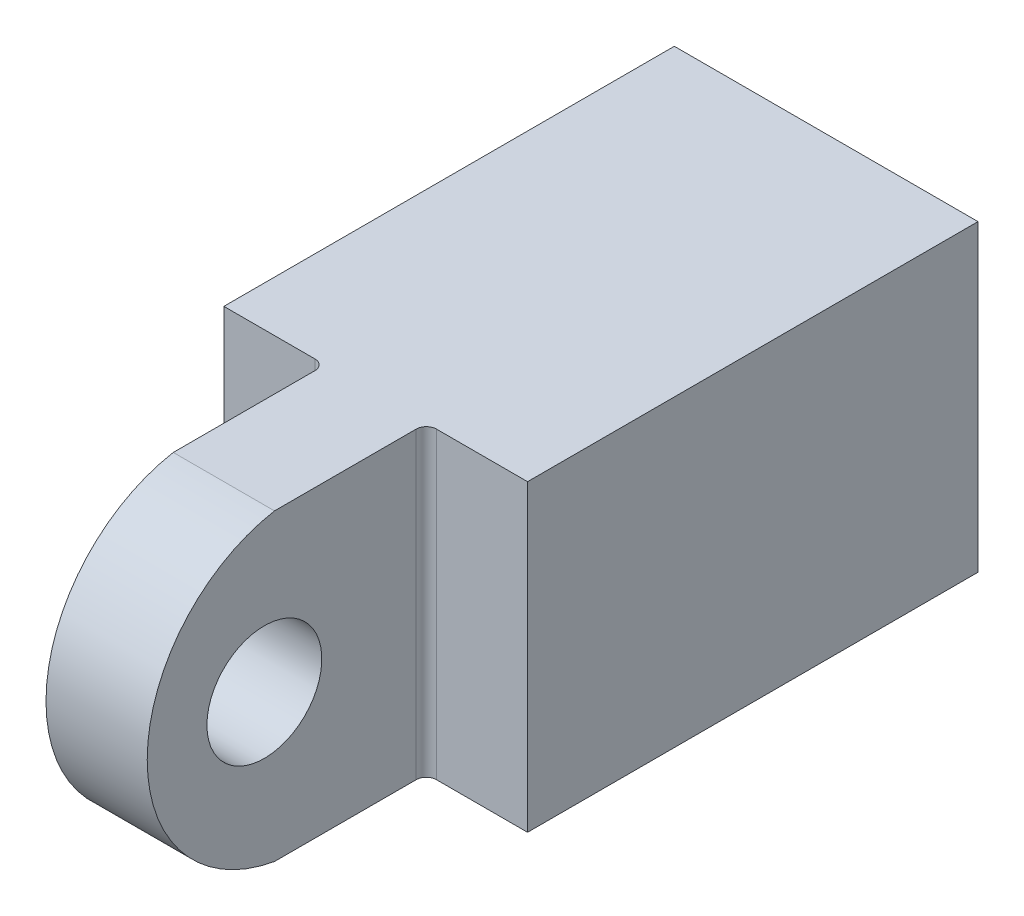
ISO-10303-21;
HEADER;
FILE_DESCRIPTION(('STEP AP214'),'2;1');
FILE_NAME('part.step','',(''),(''),'','','');
FILE_SCHEMA(('AUTOMOTIVE_DESIGN { 1 0 10303 214 1 1 1 1 }'));
ENDSEC;
DATA;
#1=APPLICATION_CONTEXT('core data for automotive mechanical design processes');
#2=APPLICATION_PROTOCOL_DEFINITION('international standard','automotive_design',2000,#1);
#3=PRODUCT_CONTEXT('',#1,'mechanical');
#4=PRODUCT('Part','Part','',(#3));
#5=PRODUCT_RELATED_PRODUCT_CATEGORY('part','',(#4));
#6=PRODUCT_DEFINITION_FORMATION('','',#4);
#7=PRODUCT_DEFINITION_CONTEXT('part definition',#1,'design');
#8=PRODUCT_DEFINITION('design','',#6,#7);
#9=PRODUCT_DEFINITION_SHAPE('','',#8);
#10=(LENGTH_UNIT() NAMED_UNIT(*) SI_UNIT(.MILLI.,.METRE.));
#11=(NAMED_UNIT(*) PLANE_ANGLE_UNIT() SI_UNIT($,.RADIAN.));
#12=(NAMED_UNIT(*) SI_UNIT($,.STERADIAN.) SOLID_ANGLE_UNIT());
#13=UNCERTAINTY_MEASURE_WITH_UNIT(LENGTH_MEASURE(1.E-05),#10,'distance_accuracy_value','');
#14=(GEOMETRIC_REPRESENTATION_CONTEXT(3) GLOBAL_UNCERTAINTY_ASSIGNED_CONTEXT((#13)) GLOBAL_UNIT_ASSIGNED_CONTEXT((#10,
#11,#12)) REPRESENTATION_CONTEXT('',''));
#15=CARTESIAN_POINT('',(0.,0.,0.));
#16=DIRECTION('',(0.,0.,1.));
#17=DIRECTION('',(1.,0.,0.));
#18=AXIS2_PLACEMENT_3D('',#15,#16,#17);
#19=CARTESIAN_POINT('',(0.,0.,0.));
#20=DIRECTION('',(0.,0.,1.));
#21=DIRECTION('',(1.,0.,0.));
#22=AXIS2_PLACEMENT_3D('',#19,#20,#21);
#23=PLANE('',#22);
#24=DIRECTION('',(0.,1.,0.));
#25=VECTOR('',#24,1.);
#26=CARTESIAN_POINT('',(30.,30.,0.));
#27=LINE('',#26,#25);
#28=CARTESIAN_POINT('',(30.,-30.,0.));
#29=VERTEX_POINT('',#28);
#30=CARTESIAN_POINT('',(30.,30.,0.));
#31=VERTEX_POINT('',#30);
#32=EDGE_CURVE('E184',#29,#31,#27,.T.);
#33=ORIENTED_EDGE('',*,*,#32,.F.);
#34=DIRECTION('',(1.,0.,0.));
#35=VECTOR('',#34,1.);
#36=CARTESIAN_POINT('',(-30.,-30.,0.));
#37=LINE('',#36,#35);
#38=CARTESIAN_POINT('',(-30.,-30.,0.));
#39=VERTEX_POINT('',#38);
#40=EDGE_CURVE('E189',#39,#29,#37,.T.);
#41=ORIENTED_EDGE('',*,*,#40,.F.);
#42=DIRECTION('',(0.,-1.,0.));
#43=VECTOR('',#42,1.);
#44=CARTESIAN_POINT('',(-30.,30.,0.));
#45=LINE('',#44,#43);
#46=CARTESIAN_POINT('',(-30.,30.,0.));
#47=VERTEX_POINT('',#46);
#48=EDGE_CURVE('E203',#47,#39,#45,.T.);
#49=ORIENTED_EDGE('',*,*,#48,.F.);
#50=DIRECTION('',(-1.,0.,0.));
#51=VECTOR('',#50,1.);
#52=CARTESIAN_POINT('',(-30.,30.,0.));
#53=LINE('',#52,#51);
#54=EDGE_CURVE('E201',#31,#47,#53,.T.);
#55=ORIENTED_EDGE('',*,*,#54,.F.);
#56=EDGE_LOOP('',(#33,#41,#49,#55));
#57=FACE_BOUND('',#56,.T.);
#58=DIRECTION('',(-1.,0.,0.));
#59=VECTOR('',#58,1.);
#60=CARTESIAN_POINT('',(25.,25.,0.));
#61=LINE('',#60,#59);
#62=CARTESIAN_POINT('',(25.,25.,0.));
#63=VERTEX_POINT('',#62);
#64=CARTESIAN_POINT('',(-25.,25.,0.));
#65=VERTEX_POINT('',#64);
#66=EDGE_CURVE('E49',#63,#65,#61,.T.);
#67=ORIENTED_EDGE('',*,*,#66,.T.);
#68=DIRECTION('',(0.,-1.,0.));
#69=VECTOR('',#68,1.);
#70=CARTESIAN_POINT('',(-25.,25.,0.));
#71=LINE('',#70,#69);
#72=CARTESIAN_POINT('',(-25.,-25.,0.));
#73=VERTEX_POINT('',#72);
#74=EDGE_CURVE('E154',#65,#73,#71,.T.);
#75=ORIENTED_EDGE('',*,*,#74,.T.);
#76=DIRECTION('',(-1.,0.,0.));
#77=VECTOR('',#76,1.);
#78=CARTESIAN_POINT('',(25.,-25.,0.));
#79=LINE('',#78,#77);
#80=CARTESIAN_POINT('',(25.,-25.,0.));
#81=VERTEX_POINT('',#80);
#82=EDGE_CURVE('E437',#81,#73,#79,.T.);
#83=ORIENTED_EDGE('',*,*,#82,.F.);
#84=DIRECTION('',(0.,-1.,0.));
#85=VECTOR('',#84,1.);
#86=CARTESIAN_POINT('',(25.,25.,0.));
#87=LINE('',#86,#85);
#88=EDGE_CURVE('E150',#63,#81,#87,.T.);
#89=ORIENTED_EDGE('',*,*,#88,.F.);
#90=EDGE_LOOP('',(#67,#75,#83,#89));
#91=FACE_BOUND('',#90,.T.);
#92=ADVANCED_FACE('F33',(#57,#91),#23,.F.);
#93=CARTESIAN_POINT('',(0.,0.,89.));
#94=DIRECTION('',(0.,0.,1.));
#95=DIRECTION('',(1.,0.,0.));
#96=AXIS2_PLACEMENT_3D('',#93,#94,#95);
#97=PLANE('',#96);
#98=DIRECTION('',(1.,0.,0.));
#99=VECTOR('',#98,1.);
#100=CARTESIAN_POINT('',(-30.,-30.,89.));
#101=LINE('',#100,#99);
#102=CARTESIAN_POINT('',(-30.,-30.,89.));
#103=VERTEX_POINT('',#102);
#104=CARTESIAN_POINT('',(-12.,-30.,89.));
#105=VERTEX_POINT('',#104);
#106=EDGE_CURVE('E196',#103,#105,#101,.T.);
#107=ORIENTED_EDGE('',*,*,#106,.T.);
#108=DIRECTION('',(0.,-1.,0.));
#109=VECTOR('',#108,1.);
#110=CARTESIAN_POINT('',(-12.,0.,89.));
#111=LINE('',#110,#109);
#112=CARTESIAN_POINT('',(-12.,30.,89.));
#113=VERTEX_POINT('',#112);
#114=EDGE_CURVE('E225',#105,#113,#111,.F.);
#115=ORIENTED_EDGE('',*,*,#114,.T.);
#116=DIRECTION('',(-1.,0.,0.));
#117=VECTOR('',#116,1.);
#118=CARTESIAN_POINT('',(-30.,30.,89.));
#119=LINE('',#118,#117);
#120=CARTESIAN_POINT('',(-30.,30.,89.));
#121=VERTEX_POINT('',#120);
#122=EDGE_CURVE('E188',#113,#121,#119,.T.);
#123=ORIENTED_EDGE('',*,*,#122,.T.);
#124=DIRECTION('',(0.,-1.,0.));
#125=VECTOR('',#124,1.);
#126=CARTESIAN_POINT('',(-30.,30.,89.));
#127=LINE('',#126,#125);
#128=EDGE_CURVE('E193',#121,#103,#127,.T.);
#129=ORIENTED_EDGE('',*,*,#128,.T.);
#130=EDGE_LOOP('',(#107,#115,#123,#129));
#131=FACE_BOUND('',#130,.T.);
#132=ADVANCED_FACE('F264',(#131),#97,.T.);
#133=CARTESIAN_POINT('',(30.,30.,89.));
#134=DIRECTION('',(-1.,0.,0.));
#135=DIRECTION('',(0.,-1.,0.));
#136=AXIS2_PLACEMENT_3D('',#133,#134,#135);
#137=PLANE('',#136);
#138=ORIENTED_EDGE('',*,*,#32,.T.);
#139=DIRECTION('',(0.,0.,-1.));
#140=VECTOR('',#139,1.);
#141=CARTESIAN_POINT('',(30.,30.,89.));
#142=LINE('',#141,#140);
#143=CARTESIAN_POINT('',(30.,30.,89.));
#144=VERTEX_POINT('',#143);
#145=EDGE_CURVE('E214',#144,#31,#142,.T.);
#146=ORIENTED_EDGE('',*,*,#145,.F.);
#147=DIRECTION('',(0.,1.,0.));
#148=VECTOR('',#147,1.);
#149=CARTESIAN_POINT('',(30.,30.,89.));
#150=LINE('',#149,#148);
#151=CARTESIAN_POINT('',(30.,-30.,89.));
#152=VERTEX_POINT('',#151);
#153=EDGE_CURVE('E185',#152,#144,#150,.T.);
#154=ORIENTED_EDGE('',*,*,#153,.F.);
#155=DIRECTION('',(0.,0.,-1.));
#156=VECTOR('',#155,1.);
#157=CARTESIAN_POINT('',(30.,-30.,89.));
#158=LINE('',#157,#156);
#159=EDGE_CURVE('E198',#152,#29,#158,.T.);
#160=ORIENTED_EDGE('',*,*,#159,.T.);
#161=EDGE_LOOP('',(#138,#146,#154,#160));
#162=FACE_BOUND('',#161,.T.);
#163=ADVANCED_FACE('F250',(#162),#137,.F.);
#164=CARTESIAN_POINT('',(-30.,30.,89.));
#165=DIRECTION('',(0.,-1.,0.));
#166=DIRECTION('',(0.,0.,-1.));
#167=AXIS2_PLACEMENT_3D('',#164,#165,#166);
#168=PLANE('',#167);
#169=ORIENTED_EDGE('',*,*,#54,.T.);
#170=DIRECTION('',(0.,0.,-1.));
#171=VECTOR('',#170,1.);
#172=CARTESIAN_POINT('',(-30.,30.,89.));
#173=LINE('',#172,#171);
#174=EDGE_CURVE('E211',#121,#47,#173,.T.);
#175=ORIENTED_EDGE('',*,*,#174,.F.);
#176=ORIENTED_EDGE('',*,*,#122,.F.);
#177=CARTESIAN_POINT('',(-12.,30.,91.));
#178=DIRECTION('',(0.,-1.,0.));
#179=DIRECTION('',(0.,0.,-1.));
#180=AXIS2_PLACEMENT_3D('',#177,#178,#179);
#181=CIRCLE('',#180,2.);
#182=CARTESIAN_POINT('',(-10.,30.,91.));
#183=VERTEX_POINT('',#182);
#184=EDGE_CURVE('E11',#113,#183,#181,.T.);
#185=ORIENTED_EDGE('',*,*,#184,.T.);
#186=DIRECTION('',(0.,0.,-1.));
#187=VECTOR('',#186,1.);
#188=CARTESIAN_POINT('',(-10.,30.,119.));
#189=LINE('',#188,#187);
#190=CARTESIAN_POINT('',(-10.,30.,119.));
#191=VERTEX_POINT('',#190);
#192=EDGE_CURVE('E173',#191,#183,#189,.T.);
#193=ORIENTED_EDGE('',*,*,#192,.F.);
#194=DIRECTION('',(-1.,0.,0.));
#195=VECTOR('',#194,1.);
#196=CARTESIAN_POINT('',(10.,30.,119.));
#197=LINE('',#196,#195);
#198=CARTESIAN_POINT('',(10.,30.,119.));
#199=VERTEX_POINT('',#198);
#200=EDGE_CURVE('E170',#199,#191,#197,.T.);
#201=ORIENTED_EDGE('',*,*,#200,.F.);
#202=DIRECTION('',(0.,0.,-1.));
#203=VECTOR('',#202,1.);
#204=CARTESIAN_POINT('',(10.,30.,119.));
#205=LINE('',#204,#203);
#206=CARTESIAN_POINT('',(10.,30.,91.));
#207=VERTEX_POINT('',#206);
#208=EDGE_CURVE('E176',#199,#207,#205,.T.);
#209=ORIENTED_EDGE('',*,*,#208,.T.);
#210=CARTESIAN_POINT('',(12.,30.,91.));
#211=DIRECTION('',(0.,-1.,0.));
#212=DIRECTION('',(0.,0.,-1.));
#213=AXIS2_PLACEMENT_3D('',#210,#211,#212);
#214=CIRCLE('',#213,2.);
#215=CARTESIAN_POINT('',(12.,30.,89.));
#216=VERTEX_POINT('',#215);
#217=EDGE_CURVE('E227',#207,#216,#214,.T.);
#218=ORIENTED_EDGE('',*,*,#217,.T.);
#219=EDGE_CURVE('E190',#144,#216,#119,.T.);
#220=ORIENTED_EDGE('',*,*,#219,.F.);
#221=ORIENTED_EDGE('',*,*,#145,.T.);
#222=EDGE_LOOP('',(#169,#175,#176,#185,#193,#201,#209,#218,#220,#221));
#223=FACE_BOUND('',#222,.T.);
#224=ADVANCED_FACE('F244',(#223),#168,.F.);
#225=CARTESIAN_POINT('',(-30.,30.,89.));
#226=DIRECTION('',(1.,0.,0.));
#227=DIRECTION('',(0.,1.,0.));
#228=AXIS2_PLACEMENT_3D('',#225,#226,#227);
#229=PLANE('',#228);
#230=ORIENTED_EDGE('',*,*,#48,.T.);
#231=DIRECTION('',(0.,0.,-1.));
#232=VECTOR('',#231,1.);
#233=CARTESIAN_POINT('',(-30.,-30.,89.));
#234=LINE('',#233,#232);
#235=EDGE_CURVE('E208',#103,#39,#234,.T.);
#236=ORIENTED_EDGE('',*,*,#235,.F.);
#237=ORIENTED_EDGE('',*,*,#128,.F.);
#238=ORIENTED_EDGE('',*,*,#174,.T.);
#239=EDGE_LOOP('',(#230,#236,#237,#238));
#240=FACE_BOUND('',#239,.T.);
#241=ADVANCED_FACE('F258',(#240),#229,.F.);
#242=CARTESIAN_POINT('',(-30.,-30.,89.));
#243=DIRECTION('',(0.,1.,0.));
#244=DIRECTION('',(0.,0.,1.));
#245=AXIS2_PLACEMENT_3D('',#242,#243,#244);
#246=PLANE('',#245);
#247=ORIENTED_EDGE('',*,*,#40,.T.);
#248=ORIENTED_EDGE('',*,*,#159,.F.);
#249=CARTESIAN_POINT('',(12.,-30.,89.));
#250=VERTEX_POINT('',#249);
#251=EDGE_CURVE('E195',#250,#152,#101,.T.);
#252=ORIENTED_EDGE('',*,*,#251,.F.);
#253=CARTESIAN_POINT('',(12.,-30.,91.));
#254=DIRECTION('',(0.,1.,0.));
#255=DIRECTION('',(0.,0.,1.));
#256=AXIS2_PLACEMENT_3D('',#253,#254,#255);
#257=CIRCLE('',#256,2.);
#258=CARTESIAN_POINT('',(10.,-30.,91.));
#259=VERTEX_POINT('',#258);
#260=EDGE_CURVE('E229',#250,#259,#257,.T.);
#261=ORIENTED_EDGE('',*,*,#260,.T.);
#262=DIRECTION('',(0.,0.,-1.));
#263=VECTOR('',#262,1.);
#264=CARTESIAN_POINT('',(10.,-30.,119.));
#265=LINE('',#264,#263);
#266=CARTESIAN_POINT('',(10.,-30.,119.));
#267=VERTEX_POINT('',#266);
#268=EDGE_CURVE('E179',#267,#259,#265,.T.);
#269=ORIENTED_EDGE('',*,*,#268,.F.);
#270=DIRECTION('',(1.,0.,0.));
#271=VECTOR('',#270,1.);
#272=CARTESIAN_POINT('',(10.,-30.,119.));
#273=LINE('',#272,#271);
#274=CARTESIAN_POINT('',(-10.,-30.,119.));
#275=VERTEX_POINT('',#274);
#276=EDGE_CURVE('E166',#275,#267,#273,.T.);
#277=ORIENTED_EDGE('',*,*,#276,.F.);
#278=DIRECTION('',(0.,0.,-1.));
#279=VECTOR('',#278,1.);
#280=CARTESIAN_POINT('',(-10.,-30.,119.));
#281=LINE('',#280,#279);
#282=CARTESIAN_POINT('',(-10.,-30.,91.));
#283=VERTEX_POINT('',#282);
#284=EDGE_CURVE('E182',#275,#283,#281,.T.);
#285=ORIENTED_EDGE('',*,*,#284,.T.);
#286=CARTESIAN_POINT('',(-12.,-30.,91.));
#287=DIRECTION('',(0.,1.,0.));
#288=DIRECTION('',(0.,0.,1.));
#289=AXIS2_PLACEMENT_3D('',#286,#287,#288);
#290=CIRCLE('',#289,2.);
#291=EDGE_CURVE('E42',#283,#105,#290,.T.);
#292=ORIENTED_EDGE('',*,*,#291,.T.);
#293=ORIENTED_EDGE('',*,*,#106,.F.);
#294=ORIENTED_EDGE('',*,*,#235,.T.);
#295=EDGE_LOOP('',(#247,#248,#252,#261,#269,#277,#285,#292,#293,#294));
#296=FACE_BOUND('',#295,.T.);
#297=ADVANCED_FACE('F233',(#296),#246,.F.);
#298=ORIENTED_EDGE('',*,*,#219,.T.);
#299=DIRECTION('',(0.,1.,0.));
#300=VECTOR('',#299,1.);
#301=CARTESIAN_POINT('',(12.,0.,89.));
#302=LINE('',#301,#300);
#303=EDGE_CURVE('E220',#216,#250,#302,.F.);
#304=ORIENTED_EDGE('',*,*,#303,.T.);
#305=ORIENTED_EDGE('',*,*,#251,.T.);
#306=ORIENTED_EDGE('',*,*,#153,.T.);
#307=EDGE_LOOP('',(#298,#304,#305,#306));
#308=FACE_BOUND('',#307,.T.);
#309=ADVANCED_FACE('F246',(#308),#97,.T.);
#310=CARTESIAN_POINT('',(-10.,-30.,119.));
#311=DIRECTION('',(1.,0.,0.));
#312=DIRECTION('',(0.,0.,-1.));
#313=AXIS2_PLACEMENT_3D('',#310,#311,#312);
#314=PLANE('',#313);
#315=CARTESIAN_POINT('',(-10.,0.,121.));
#316=DIRECTION('',(-1.,0.,0.));
#317=DIRECTION('',(0.,0.,1.));
#318=AXIS2_PLACEMENT_3D('',#315,#316,#317);
#319=CIRCLE('',#318,11.35);
#320=CARTESIAN_POINT('',(-10.,0.,132.35));
#321=VERTEX_POINT('',#320);
#322=EDGE_CURVE('E449',#321,#321,#319,.T.);
#323=ORIENTED_EDGE('',*,*,#322,.F.);
#324=EDGE_LOOP('',(#323));
#325=FACE_BOUND('',#324,.T.);
#326=ORIENTED_EDGE('',*,*,#192,.T.);
#327=DIRECTION('',(0.,-1.,0.));
#328=VECTOR('',#327,1.);
#329=CARTESIAN_POINT('',(-10.,-30.,91.));
#330=LINE('',#329,#328);
#331=EDGE_CURVE('E222',#183,#283,#330,.T.);
#332=ORIENTED_EDGE('',*,*,#331,.T.);
#333=ORIENTED_EDGE('',*,*,#284,.F.);
#334=CARTESIAN_POINT('',(-10.,0.,113.675895734686));
#335=DIRECTION('',(1.,0.,0.));
#336=DIRECTION('',(0.,0.,1.));
#337=AXIS2_PLACEMENT_3D('',#334,#335,#336);
#338=CIRCLE('',#337,30.4687723124503);
#339=EDGE_CURVE('E159',#191,#275,#338,.T.);
#340=ORIENTED_EDGE('',*,*,#339,.F.);
#341=EDGE_LOOP('',(#326,#332,#333,#340));
#342=FACE_BOUND('',#341,.T.);
#343=ADVANCED_FACE('F270',(#325,#342),#314,.F.);
#344=CARTESIAN_POINT('',(10.,-30.,119.));
#345=DIRECTION('',(-1.,0.,0.));
#346=DIRECTION('',(0.,0.,1.));
#347=AXIS2_PLACEMENT_3D('',#344,#345,#346);
#348=PLANE('',#347);
#349=CARTESIAN_POINT('',(10.,0.,121.));
#350=DIRECTION('',(-1.,0.,0.));
#351=DIRECTION('',(0.,0.,1.));
#352=AXIS2_PLACEMENT_3D('',#349,#350,#351);
#353=CIRCLE('',#352,11.35);
#354=CARTESIAN_POINT('',(10.,0.,132.35));
#355=VERTEX_POINT('',#354);
#356=EDGE_CURVE('E37',#355,#355,#353,.T.);
#357=ORIENTED_EDGE('',*,*,#356,.T.);
#358=EDGE_LOOP('',(#357));
#359=FACE_BOUND('',#358,.T.);
#360=ORIENTED_EDGE('',*,*,#268,.T.);
#361=DIRECTION('',(0.,1.,0.));
#362=VECTOR('',#361,1.);
#363=CARTESIAN_POINT('',(10.,-30.,91.));
#364=LINE('',#363,#362);
#365=EDGE_CURVE('E217',#259,#207,#364,.T.);
#366=ORIENTED_EDGE('',*,*,#365,.T.);
#367=ORIENTED_EDGE('',*,*,#208,.F.);
#368=CARTESIAN_POINT('',(10.,0.,113.675895734686));
#369=DIRECTION('',(1.,0.,0.));
#370=DIRECTION('',(0.,0.,1.));
#371=AXIS2_PLACEMENT_3D('',#368,#369,#370);
#372=CIRCLE('',#371,30.4687723124503);
#373=EDGE_CURVE('E155',#199,#267,#372,.T.);
#374=ORIENTED_EDGE('',*,*,#373,.T.);
#375=EDGE_LOOP('',(#360,#366,#367,#374));
#376=FACE_BOUND('',#375,.T.);
#377=ADVANCED_FACE('F239',(#359,#376),#348,.F.);
#378=CARTESIAN_POINT('',(-10.,0.,113.675895734686));
#379=DIRECTION('',(1.,0.,0.));
#380=DIRECTION('',(0.,0.,-1.));
#381=AXIS2_PLACEMENT_3D('',#378,#379,#380);
#382=CYLINDRICAL_SURFACE('',#381,30.4687723124503);
#383=ORIENTED_EDGE('',*,*,#373,.F.);
#384=ORIENTED_EDGE('',*,*,#200,.T.);
#385=ORIENTED_EDGE('',*,*,#339,.T.);
#386=ORIENTED_EDGE('',*,*,#276,.T.);
#387=EDGE_LOOP('',(#383,#384,#385,#386));
#388=FACE_BOUND('',#387,.T.);
#389=ADVANCED_FACE('F273',(#388),#382,.T.);
#390=CARTESIAN_POINT('',(12.,-30.,91.));
#391=DIRECTION('',(0.,1.,0.));
#392=DIRECTION('',(0.,0.,1.));
#393=AXIS2_PLACEMENT_3D('',#390,#391,#392);
#394=CYLINDRICAL_SURFACE('',#393,2.);
#395=ORIENTED_EDGE('',*,*,#260,.F.);
#396=ORIENTED_EDGE('',*,*,#303,.F.);
#397=ORIENTED_EDGE('',*,*,#217,.F.);
#398=ORIENTED_EDGE('',*,*,#365,.F.);
#399=EDGE_LOOP('',(#395,#396,#397,#398));
#400=FACE_BOUND('',#399,.T.);
#401=ADVANCED_FACE('F242',(#400),#394,.F.);
#402=CARTESIAN_POINT('',(-12.,-30.,91.));
#403=DIRECTION('',(0.,-1.,0.));
#404=DIRECTION('',(0.,0.,-1.));
#405=AXIS2_PLACEMENT_3D('',#402,#403,#404);
#406=CYLINDRICAL_SURFACE('',#405,2.);
#407=ORIENTED_EDGE('',*,*,#184,.F.);
#408=ORIENTED_EDGE('',*,*,#114,.F.);
#409=ORIENTED_EDGE('',*,*,#291,.F.);
#410=ORIENTED_EDGE('',*,*,#331,.F.);
#411=EDGE_LOOP('',(#407,#408,#409,#410));
#412=FACE_BOUND('',#411,.T.);
#413=ADVANCED_FACE('F35',(#412),#406,.F.);
#414=CARTESIAN_POINT('',(25.,25.,81.0000000000001));
#415=DIRECTION('',(0.,-1.,0.));
#416=DIRECTION('',(0.,0.,-1.));
#417=AXIS2_PLACEMENT_3D('',#414,#415,#416);
#418=PLANE('',#417);
#419=ORIENTED_EDGE('',*,*,#66,.F.);
#420=DIRECTION('',(0.,0.,-1.));
#421=VECTOR('',#420,1.);
#422=CARTESIAN_POINT('',(25.,25.,81.0000000000001));
#423=LINE('',#422,#421);
#424=CARTESIAN_POINT('',(25.,25.,81.0000000000001));
#425=VERTEX_POINT('',#424);
#426=EDGE_CURVE('E149',#425,#63,#423,.T.);
#427=ORIENTED_EDGE('',*,*,#426,.F.);
#428=DIRECTION('',(-1.,0.,0.));
#429=VECTOR('',#428,1.);
#430=CARTESIAN_POINT('',(25.,25.,81.0000000000001));
#431=LINE('',#430,#429);
#432=CARTESIAN_POINT('',(-25.,25.,81.0000000000001));
#433=VERTEX_POINT('',#432);
#434=EDGE_CURVE('E139',#425,#433,#431,.T.);
#435=ORIENTED_EDGE('',*,*,#434,.T.);
#436=DIRECTION('',(0.,0.,-1.));
#437=VECTOR('',#436,1.);
#438=CARTESIAN_POINT('',(-25.,25.,81.0000000000001));
#439=LINE('',#438,#437);
#440=EDGE_CURVE('E148',#433,#65,#439,.T.);
#441=ORIENTED_EDGE('',*,*,#440,.T.);
#442=EDGE_LOOP('',(#419,#427,#435,#441));
#443=FACE_BOUND('',#442,.T.);
#444=ADVANCED_FACE('F147',(#443),#418,.T.);
#445=CARTESIAN_POINT('',(-25.,25.,81.0000000000001));
#446=DIRECTION('',(1.,0.,0.));
#447=DIRECTION('',(0.,0.,-1.));
#448=AXIS2_PLACEMENT_3D('',#445,#446,#447);
#449=PLANE('',#448);
#450=ORIENTED_EDGE('',*,*,#74,.F.);
#451=ORIENTED_EDGE('',*,*,#440,.F.);
#452=DIRECTION('',(0.,-1.,0.));
#453=VECTOR('',#452,1.);
#454=CARTESIAN_POINT('',(-25.,25.,81.0000000000001));
#455=LINE('',#454,#453);
#456=CARTESIAN_POINT('',(-25.,-25.,81.0000000000001));
#457=VERTEX_POINT('',#456);
#458=EDGE_CURVE('E135',#433,#457,#455,.T.);
#459=ORIENTED_EDGE('',*,*,#458,.T.);
#460=DIRECTION('',(0.,0.,-1.));
#461=VECTOR('',#460,1.);
#462=CARTESIAN_POINT('',(-25.,-25.,81.0000000000001));
#463=LINE('',#462,#461);
#464=EDGE_CURVE('E156',#457,#73,#463,.T.);
#465=ORIENTED_EDGE('',*,*,#464,.T.);
#466=EDGE_LOOP('',(#450,#451,#459,#465));
#467=FACE_BOUND('',#466,.T.);
#468=ADVANCED_FACE('F152',(#467),#449,.T.);
#469=CARTESIAN_POINT('',(25.,-25.,81.0000000000001));
#470=DIRECTION('',(0.,-1.,0.));
#471=DIRECTION('',(0.,0.,-1.));
#472=AXIS2_PLACEMENT_3D('',#469,#470,#471);
#473=PLANE('',#472);
#474=ORIENTED_EDGE('',*,*,#82,.T.);
#475=ORIENTED_EDGE('',*,*,#464,.F.);
#476=DIRECTION('',(-1.,0.,0.));
#477=VECTOR('',#476,1.);
#478=CARTESIAN_POINT('',(25.,-25.,81.0000000000001));
#479=LINE('',#478,#477);
#480=CARTESIAN_POINT('',(25.,-25.,81.0000000000001));
#481=VERTEX_POINT('',#480);
#482=EDGE_CURVE('E142',#481,#457,#479,.T.);
#483=ORIENTED_EDGE('',*,*,#482,.F.);
#484=DIRECTION('',(0.,0.,-1.));
#485=VECTOR('',#484,1.);
#486=CARTESIAN_POINT('',(25.,-25.,81.0000000000001));
#487=LINE('',#486,#485);
#488=EDGE_CURVE('E161',#481,#81,#487,.T.);
#489=ORIENTED_EDGE('',*,*,#488,.T.);
#490=EDGE_LOOP('',(#474,#475,#483,#489));
#491=FACE_BOUND('',#490,.T.);
#492=ADVANCED_FACE('F357',(#491),#473,.F.);
#493=CARTESIAN_POINT('',(25.,25.,81.0000000000001));
#494=DIRECTION('',(1.,0.,0.));
#495=DIRECTION('',(0.,0.,-1.));
#496=AXIS2_PLACEMENT_3D('',#493,#494,#495);
#497=PLANE('',#496);
#498=ORIENTED_EDGE('',*,*,#88,.T.);
#499=ORIENTED_EDGE('',*,*,#488,.F.);
#500=DIRECTION('',(0.,-1.,0.));
#501=VECTOR('',#500,1.);
#502=CARTESIAN_POINT('',(25.,25.,81.0000000000001));
#503=LINE('',#502,#501);
#504=EDGE_CURVE('E446',#425,#481,#503,.T.);
#505=ORIENTED_EDGE('',*,*,#504,.F.);
#506=ORIENTED_EDGE('',*,*,#426,.T.);
#507=EDGE_LOOP('',(#498,#499,#505,#506));
#508=FACE_BOUND('',#507,.T.);
#509=ADVANCED_FACE('F351',(#508),#497,.F.);
#510=CARTESIAN_POINT('',(0.,0.,81.0000000000001));
#511=DIRECTION('',(0.,0.,1.));
#512=DIRECTION('',(1.,0.,0.));
#513=AXIS2_PLACEMENT_3D('',#510,#511,#512);
#514=PLANE('',#513);
#515=ORIENTED_EDGE('',*,*,#434,.F.);
#516=ORIENTED_EDGE('',*,*,#504,.T.);
#517=ORIENTED_EDGE('',*,*,#482,.T.);
#518=ORIENTED_EDGE('',*,*,#458,.F.);
#519=EDGE_LOOP('',(#515,#516,#517,#518));
#520=FACE_BOUND('',#519,.T.);
#521=ADVANCED_FACE('F137',(#520),#514,.F.);
#522=CARTESIAN_POINT('',(30.,0.,121.));
#523=DIRECTION('',(-1.,0.,0.));
#524=DIRECTION('',(0.,0.,1.));
#525=AXIS2_PLACEMENT_3D('',#522,#523,#524);
#526=CYLINDRICAL_SURFACE('',#525,11.35);
#527=ORIENTED_EDGE('',*,*,#322,.T.);
#528=EDGE_LOOP('',(#527));
#529=FACE_BOUND('',#528,.T.);
#530=ORIENTED_EDGE('',*,*,#356,.F.);
#531=EDGE_LOOP('',(#530));
#532=FACE_BOUND('',#531,.T.);
#533=ADVANCED_FACE('F338',(#529,#532),#526,.F.);
#534=CLOSED_SHELL('',(#92,#132,#163,#224,#241,#297,#309,#343,#377,#389,#401,#413,#444,#468,#492,
#509,#521,#533));
#535=MANIFOLD_SOLID_BREP('B2',#534);
#536=ADVANCED_BREP_SHAPE_REPRESENTATION('',(#18,#535),#14);
#537=SHAPE_DEFINITION_REPRESENTATION(#9,#536);
ENDSEC;
END-ISO-10303-21;
